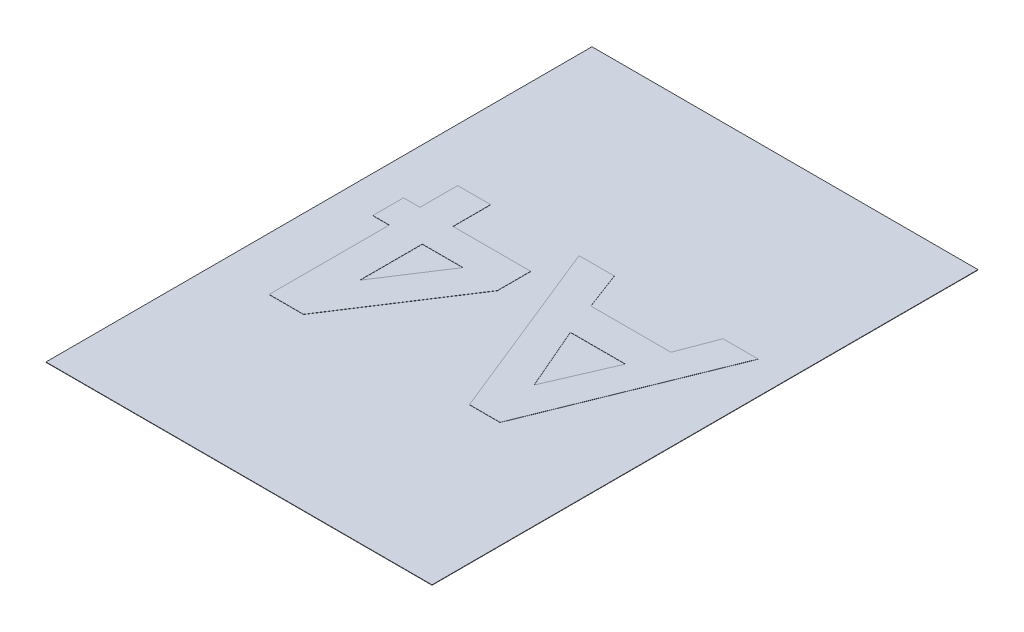
ISO-10303-21;
HEADER;
FILE_DESCRIPTION(('STEP AP214'),'2;1');
FILE_NAME('part.step','',(''),(''),'','','');
FILE_SCHEMA(('AUTOMOTIVE_DESIGN { 1 0 10303 214 1 1 1 1 }'));
ENDSEC;
DATA;
#1=APPLICATION_CONTEXT('core data for automotive mechanical design processes');
#2=APPLICATION_PROTOCOL_DEFINITION('international standard','automotive_design',2000,#1);
#3=PRODUCT_CONTEXT('',#1,'mechanical');
#4=PRODUCT('Part','Part','',(#3));
#5=PRODUCT_RELATED_PRODUCT_CATEGORY('part','',(#4));
#6=PRODUCT_DEFINITION_FORMATION('','',#4);
#7=PRODUCT_DEFINITION_CONTEXT('part definition',#1,'design');
#8=PRODUCT_DEFINITION('design','',#6,#7);
#9=PRODUCT_DEFINITION_SHAPE('','',#8);
#10=(LENGTH_UNIT() NAMED_UNIT(*) SI_UNIT(.MILLI.,.METRE.));
#11=(NAMED_UNIT(*) PLANE_ANGLE_UNIT() SI_UNIT($,.RADIAN.));
#12=(NAMED_UNIT(*) SI_UNIT($,.STERADIAN.) SOLID_ANGLE_UNIT());
#13=UNCERTAINTY_MEASURE_WITH_UNIT(LENGTH_MEASURE(1.E-05),#10,'distance_accuracy_value','');
#14=(GEOMETRIC_REPRESENTATION_CONTEXT(3) GLOBAL_UNCERTAINTY_ASSIGNED_CONTEXT((#13)) GLOBAL_UNIT_ASSIGNED_CONTEXT((#10,
#11,#12)) REPRESENTATION_CONTEXT('',''));
#15=CARTESIAN_POINT('',(0.,0.,0.));
#16=DIRECTION('',(0.,0.,1.));
#17=DIRECTION('',(1.,0.,0.));
#18=AXIS2_PLACEMENT_3D('',#15,#16,#17);
#19=CARTESIAN_POINT('',(0.,0.2,-297.));
#20=DIRECTION('',(0.,-1.,0.));
#21=DIRECTION('',(0.,0.,-1.));
#22=AXIS2_PLACEMENT_3D('',#19,#20,#21);
#23=PLANE('',#22);
#24=DIRECTION('',(0.,0.,1.));
#25=VECTOR('',#24,1.);
#26=CARTESIAN_POINT('',(89.2336306263011,0.2,-174.45865151581));
#27=LINE('',#26,#25);
#28=CARTESIAN_POINT('',(89.2336306263011,0.2,-174.45865151581));
#29=VERTEX_POINT('',#28);
#30=CARTESIAN_POINT('',(89.2336306263011,0.2,-156.289581002989));
#31=VERTEX_POINT('',#30);
#32=EDGE_CURVE('E258',#29,#31,#27,.T.);
#33=ORIENTED_EDGE('',*,*,#32,.T.);
#34=DIRECTION('',(-0.545200849923092,0.,0.838305453425622));
#35=VECTOR('',#34,1.);
#36=CARTESIAN_POINT('',(89.2336306263011,0.2,-156.289581002989));
#37=LINE('',#36,#35);
#38=CARTESIAN_POINT('',(47.6871562673268,0.2,-92.4073694645276));
#39=VERTEX_POINT('',#38);
#40=EDGE_CURVE('E239',#31,#39,#37,.T.);
#41=ORIENTED_EDGE('',*,*,#40,.T.);
#42=DIRECTION('',(-1.,0.,0.));
#43=VECTOR('',#42,1.);
#44=CARTESIAN_POINT('',(47.6871562673268,0.2,-92.4073694645276));
#45=LINE('',#44,#43);
#46=CARTESIAN_POINT('',(28.9772203698909,0.2,-92.4073694645276));
#47=VERTEX_POINT('',#46);
#48=EDGE_CURVE('E291',#39,#47,#45,.T.);
#49=ORIENTED_EDGE('',*,*,#48,.T.);
#50=DIRECTION('',(0.,0.,-1.));
#51=VECTOR('',#50,1.);
#52=CARTESIAN_POINT('',(28.9772203698909,0.2,-92.4073694645276));
#53=LINE('',#52,#51);
#54=CARTESIAN_POINT('',(28.9772203698909,0.2,-157.791984849143));
#55=VERTEX_POINT('',#54);
#56=EDGE_CURVE('E46',#47,#55,#53,.T.);
#57=ORIENTED_EDGE('',*,*,#56,.T.);
#58=DIRECTION('',(-1.,0.,0.));
#59=VECTOR('',#58,1.);
#60=CARTESIAN_POINT('',(28.9772203698909,0.2,-157.791984849143));
#61=LINE('',#60,#59);
#62=CARTESIAN_POINT('',(20.0028613955319,0.2,-157.791984849143));
#63=VERTEX_POINT('',#62);
#64=EDGE_CURVE('E295',#55,#63,#61,.T.);
#65=ORIENTED_EDGE('',*,*,#64,.T.);
#66=DIRECTION('',(0.,0.,-1.));
#67=VECTOR('',#66,1.);
#68=CARTESIAN_POINT('',(20.0028613955319,0.2,-157.791984849143));
#69=LINE('',#68,#67);
#70=CARTESIAN_POINT('',(20.0028613955319,0.2,-174.45865151581));
#71=VERTEX_POINT('',#70);
#72=EDGE_CURVE('E298',#63,#71,#69,.T.);
#73=ORIENTED_EDGE('',*,*,#72,.T.);
#74=DIRECTION('',(1.,0.,0.));
#75=VECTOR('',#74,1.);
#76=CARTESIAN_POINT('',(20.0028613955319,0.2,-174.45865151581));
#77=LINE('',#76,#75);
#78=CARTESIAN_POINT('',(28.9772203698909,0.2,-174.45865151581));
#79=VERTEX_POINT('',#78);
#80=EDGE_CURVE('E301',#71,#79,#77,.T.);
#81=ORIENTED_EDGE('',*,*,#80,.T.);
#82=DIRECTION('',(0.,0.,-1.));
#83=VECTOR('',#82,1.);
#84=CARTESIAN_POINT('',(28.9772203698909,0.2,-174.45865151581));
#85=LINE('',#84,#83);
#86=CARTESIAN_POINT('',(28.9772203698909,0.2,-194.97147202863));
#87=VERTEX_POINT('',#86);
#88=EDGE_CURVE('E304',#79,#87,#85,.T.);
#89=ORIENTED_EDGE('',*,*,#88,.T.);
#90=DIRECTION('',(1.,0.,0.));
#91=VECTOR('',#90,1.);
#92=CARTESIAN_POINT('',(28.9772203698909,0.2,-194.97147202863));
#93=LINE('',#92,#91);
#94=CARTESIAN_POINT('',(46.9259383186088,0.2,-194.97147202863));
#95=VERTEX_POINT('',#94);
#96=EDGE_CURVE('E307',#87,#95,#93,.T.);
#97=ORIENTED_EDGE('',*,*,#96,.T.);
#98=DIRECTION('',(0.,0.,1.));
#99=VECTOR('',#98,1.);
#100=CARTESIAN_POINT('',(46.9259383186088,0.2,-194.97147202863));
#101=LINE('',#100,#99);
#102=CARTESIAN_POINT('',(46.9259383186088,0.2,-174.45865151581));
#103=VERTEX_POINT('',#102);
#104=EDGE_CURVE('E310',#95,#103,#101,.T.);
#105=ORIENTED_EDGE('',*,*,#104,.T.);
#106=DIRECTION('',(1.,0.,0.));
#107=VECTOR('',#106,1.);
#108=CARTESIAN_POINT('',(46.9259383186088,0.2,-174.45865151581));
#109=LINE('',#108,#107);
#110=EDGE_CURVE('E313',#103,#29,#109,.T.);
#111=ORIENTED_EDGE('',*,*,#110,.T.);
#112=EDGE_LOOP('',(#33,#41,#49,#57,#65,#73,#81,#89,#97,#105,#111));
#113=FACE_BOUND('',#112,.T.);
#114=DIRECTION('',(0.,0.,1.));
#115=VECTOR('',#114,1.);
#116=CARTESIAN_POINT('',(0.,0.2,0.));
#117=LINE('',#116,#115);
#118=CARTESIAN_POINT('',(0.,0.2,-297.));
#119=VERTEX_POINT('',#118);
#120=CARTESIAN_POINT('',(0.,0.2,0.));
#121=VERTEX_POINT('',#120);
#122=EDGE_CURVE('E428',#119,#121,#117,.T.);
#123=ORIENTED_EDGE('',*,*,#122,.T.);
#124=DIRECTION('',(1.,0.,0.));
#125=VECTOR('',#124,1.);
#126=CARTESIAN_POINT('',(0.,0.2,0.));
#127=LINE('',#126,#125);
#128=CARTESIAN_POINT('',(210.,0.2,0.));
#129=VERTEX_POINT('',#128);
#130=EDGE_CURVE('E431',#121,#129,#127,.T.);
#131=ORIENTED_EDGE('',*,*,#130,.T.);
#132=DIRECTION('',(0.,0.,-1.));
#133=VECTOR('',#132,1.);
#134=CARTESIAN_POINT('',(210.,0.2,0.));
#135=LINE('',#134,#133);
#136=CARTESIAN_POINT('',(210.,0.2,-297.));
#137=VERTEX_POINT('',#136);
#138=EDGE_CURVE('E434',#129,#137,#135,.T.);
#139=ORIENTED_EDGE('',*,*,#138,.T.);
#140=DIRECTION('',(-1.,0.,0.));
#141=VECTOR('',#140,1.);
#142=CARTESIAN_POINT('',(0.,0.2,-297.));
#143=LINE('',#142,#141);
#144=EDGE_CURVE('E436',#137,#119,#143,.T.);
#145=ORIENTED_EDGE('',*,*,#144,.T.);
#146=EDGE_LOOP('',(#123,#131,#139,#145));
#147=FACE_BOUND('',#146,.T.);
#148=DIRECTION('',(1.,0.,0.));
#149=VECTOR('',#148,1.);
#150=CARTESIAN_POINT('',(173.288117805788,0.2,-194.97147202863));
#151=LINE('',#150,#149);
#152=CARTESIAN_POINT('',(173.288117805788,0.2,-194.97147202863));
#153=VERTEX_POINT('',#152);
#154=CARTESIAN_POINT('',(192.438758831429,0.2,-194.97147202863));
#155=VERTEX_POINT('',#154);
#156=EDGE_CURVE('E367',#153,#155,#151,.T.);
#157=ORIENTED_EDGE('',*,*,#156,.T.);
#158=DIRECTION('',(-0.374622732778073,0.,0.927177333677808));
#159=VECTOR('',#158,1.);
#160=CARTESIAN_POINT('',(192.438758831429,0.2,-194.97147202863));
#161=LINE('',#160,#159);
#162=CARTESIAN_POINT('',(152.034111395532,0.2,-94.9714720286302));
#163=VERTEX_POINT('',#162);
#164=EDGE_CURVE('E362',#155,#163,#161,.T.);
#165=ORIENTED_EDGE('',*,*,#164,.T.);
#166=DIRECTION('',(-1.,0.,0.));
#167=VECTOR('',#166,1.);
#168=CARTESIAN_POINT('',(152.034111395532,0.2,-94.9714720286302));
#169=LINE('',#168,#167);
#170=CARTESIAN_POINT('',(135.387476780147,0.2,-94.9714720286302));
#171=VERTEX_POINT('',#170);
#172=EDGE_CURVE('E391',#163,#171,#169,.T.);
#173=ORIENTED_EDGE('',*,*,#172,.T.);
#174=DIRECTION('',(-0.374463049601283,0.,-0.92724183710794));
#175=VECTOR('',#174,1.);
#176=CARTESIAN_POINT('',(135.387476780147,0.2,-94.9714720286302));
#177=LINE('',#176,#175);
#178=CARTESIAN_POINT('',(95.0028613955319,0.2,-194.97147202863));
#179=VERTEX_POINT('',#178);
#180=EDGE_CURVE('E394',#171,#179,#177,.T.);
#181=ORIENTED_EDGE('',*,*,#180,.T.);
#182=DIRECTION('',(1.,0.,0.));
#183=VECTOR('',#182,1.);
#184=CARTESIAN_POINT('',(95.0028613955319,0.2,-194.97147202863));
#185=LINE('',#184,#183);
#186=CARTESIAN_POINT('',(114.173534472455,0.2,-194.97147202863));
#187=VERTEX_POINT('',#186);
#188=EDGE_CURVE('E397',#179,#187,#185,.T.);
#189=ORIENTED_EDGE('',*,*,#188,.T.);
#190=DIRECTION('',(0.354323863096984,0.,0.935122772709568));
#191=VECTOR('',#190,1.);
#192=CARTESIAN_POINT('',(114.173534472455,0.2,-194.97147202863));
#193=LINE('',#192,#191);
#194=CARTESIAN_POINT('',(121.945970369891,0.2,-174.45865151581));
#195=VERTEX_POINT('',#194);
#196=EDGE_CURVE('E400',#187,#195,#193,.T.);
#197=ORIENTED_EDGE('',*,*,#196,.T.);
#198=DIRECTION('',(1.,0.,0.));
#199=VECTOR('',#198,1.);
#200=CARTESIAN_POINT('',(121.945970369891,0.2,-174.45865151581));
#201=LINE('',#200,#199);
#202=CARTESIAN_POINT('',(165.515681908352,0.2,-174.45865151581));
#203=VERTEX_POINT('',#202);
#204=EDGE_CURVE('E403',#195,#203,#201,.T.);
#205=ORIENTED_EDGE('',*,*,#204,.T.);
#206=DIRECTION('',(0.354323863096984,0.,-0.935122772709568));
#207=VECTOR('',#206,1.);
#208=CARTESIAN_POINT('',(165.515681908352,0.2,-174.45865151581));
#209=LINE('',#208,#207);
#210=EDGE_CURVE('E406',#203,#153,#209,.T.);
#211=ORIENTED_EDGE('',*,*,#210,.T.);
#212=EDGE_LOOP('',(#157,#165,#173,#181,#189,#197,#205,#211));
#213=FACE_BOUND('',#212,.T.);
#214=ADVANCED_FACE('F31',(#113,#147,#213),#23,.F.);
#215=CARTESIAN_POINT('',(0.,0.2,0.));
#216=DIRECTION('',(1.,0.,0.));
#217=DIRECTION('',(0.,0.,-1.));
#218=AXIS2_PLACEMENT_3D('',#215,#216,#217);
#219=PLANE('',#218);
#220=DIRECTION('',(0.,0.,1.));
#221=VECTOR('',#220,1.);
#222=CARTESIAN_POINT('',(0.,0.,0.));
#223=LINE('',#222,#221);
#224=CARTESIAN_POINT('',(0.,0.,-297.));
#225=VERTEX_POINT('',#224);
#226=CARTESIAN_POINT('',(0.,0.,0.));
#227=VERTEX_POINT('',#226);
#228=EDGE_CURVE('E413',#225,#227,#223,.T.);
#229=ORIENTED_EDGE('',*,*,#228,.T.);
#230=DIRECTION('',(0.,-1.,0.));
#231=VECTOR('',#230,1.);
#232=CARTESIAN_POINT('',(0.,0.2,0.));
#233=LINE('',#232,#231);
#234=EDGE_CURVE('E11',#121,#227,#233,.T.);
#235=ORIENTED_EDGE('',*,*,#234,.F.);
#236=ORIENTED_EDGE('',*,*,#122,.F.);
#237=DIRECTION('',(0.,-1.,0.));
#238=VECTOR('',#237,1.);
#239=CARTESIAN_POINT('',(0.,0.2,-297.));
#240=LINE('',#239,#238);
#241=EDGE_CURVE('E438',#119,#225,#240,.T.);
#242=ORIENTED_EDGE('',*,*,#241,.T.);
#243=EDGE_LOOP('',(#229,#235,#236,#242));
#244=FACE_BOUND('',#243,.T.);
#245=ADVANCED_FACE('F33',(#244),#219,.F.);
#246=CARTESIAN_POINT('',(0.,0.2,0.));
#247=DIRECTION('',(0.,0.,-1.));
#248=DIRECTION('',(-1.,0.,0.));
#249=AXIS2_PLACEMENT_3D('',#246,#247,#248);
#250=PLANE('',#249);
#251=DIRECTION('',(1.,0.,0.));
#252=VECTOR('',#251,1.);
#253=CARTESIAN_POINT('',(0.,0.,0.));
#254=LINE('',#253,#252);
#255=CARTESIAN_POINT('',(210.,0.,0.));
#256=VERTEX_POINT('',#255);
#257=EDGE_CURVE('E441',#227,#256,#254,.T.);
#258=ORIENTED_EDGE('',*,*,#257,.T.);
#259=DIRECTION('',(0.,-1.,0.));
#260=VECTOR('',#259,1.);
#261=CARTESIAN_POINT('',(210.,0.2,0.));
#262=LINE('',#261,#260);
#263=EDGE_CURVE('E39',#129,#256,#262,.T.);
#264=ORIENTED_EDGE('',*,*,#263,.F.);
#265=ORIENTED_EDGE('',*,*,#130,.F.);
#266=ORIENTED_EDGE('',*,*,#234,.T.);
#267=EDGE_LOOP('',(#258,#264,#265,#266));
#268=FACE_BOUND('',#267,.T.);
#269=ADVANCED_FACE('F471',(#268),#250,.F.);
#270=CARTESIAN_POINT('',(210.,0.2,0.));
#271=DIRECTION('',(-1.,0.,0.));
#272=DIRECTION('',(0.,0.,1.));
#273=AXIS2_PLACEMENT_3D('',#270,#271,#272);
#274=PLANE('',#273);
#275=DIRECTION('',(0.,0.,-1.));
#276=VECTOR('',#275,1.);
#277=CARTESIAN_POINT('',(210.,0.,0.));
#278=LINE('',#277,#276);
#279=CARTESIAN_POINT('',(210.,0.,-297.));
#280=VERTEX_POINT('',#279);
#281=EDGE_CURVE('E443',#256,#280,#278,.T.);
#282=ORIENTED_EDGE('',*,*,#281,.T.);
#283=DIRECTION('',(0.,-1.,0.));
#284=VECTOR('',#283,1.);
#285=CARTESIAN_POINT('',(210.,0.2,-297.));
#286=LINE('',#285,#284);
#287=EDGE_CURVE('E448',#137,#280,#286,.T.);
#288=ORIENTED_EDGE('',*,*,#287,.F.);
#289=ORIENTED_EDGE('',*,*,#138,.F.);
#290=ORIENTED_EDGE('',*,*,#263,.T.);
#291=EDGE_LOOP('',(#282,#288,#289,#290));
#292=FACE_BOUND('',#291,.T.);
#293=ADVANCED_FACE('F455',(#292),#274,.F.);
#294=CARTESIAN_POINT('',(0.,0.2,-297.));
#295=DIRECTION('',(0.,0.,1.));
#296=DIRECTION('',(1.,0.,0.));
#297=AXIS2_PLACEMENT_3D('',#294,#295,#296);
#298=PLANE('',#297);
#299=DIRECTION('',(-1.,0.,0.));
#300=VECTOR('',#299,1.);
#301=CARTESIAN_POINT('',(0.,0.,-297.));
#302=LINE('',#301,#300);
#303=EDGE_CURVE('E432',#280,#225,#302,.T.);
#304=ORIENTED_EDGE('',*,*,#303,.T.);
#305=ORIENTED_EDGE('',*,*,#241,.F.);
#306=ORIENTED_EDGE('',*,*,#144,.F.);
#307=ORIENTED_EDGE('',*,*,#287,.T.);
#308=EDGE_LOOP('',(#304,#305,#306,#307));
#309=FACE_BOUND('',#308,.T.);
#310=ADVANCED_FACE('F464',(#309),#298,.F.);
#311=CARTESIAN_POINT('',(0.,0.,-297.));
#312=DIRECTION('',(0.,-1.,0.));
#313=DIRECTION('',(0.,0.,-1.));
#314=AXIS2_PLACEMENT_3D('',#311,#312,#313);
#315=PLANE('',#314);
#316=ORIENTED_EDGE('',*,*,#228,.F.);
#317=ORIENTED_EDGE('',*,*,#303,.F.);
#318=ORIENTED_EDGE('',*,*,#281,.F.);
#319=ORIENTED_EDGE('',*,*,#257,.F.);
#320=EDGE_LOOP('',(#316,#317,#318,#319));
#321=FACE_BOUND('',#320,.T.);
#322=ADVANCED_FACE('F461',(#321),#315,.T.);
#323=CARTESIAN_POINT('',(152.034111395532,0.3,-94.9714720286302));
#324=DIRECTION('',(0.,-1.,0.));
#325=DIRECTION('',(0.,0.,-1.));
#326=AXIS2_PLACEMENT_3D('',#323,#324,#325);
#327=PLANE('',#326);
#328=DIRECTION('',(-0.374622732778073,0.,0.927177333677808));
#329=VECTOR('',#328,1.);
#330=CARTESIAN_POINT('',(192.438758831429,0.3,-194.97147202863));
#331=LINE('',#330,#329);
#332=CARTESIAN_POINT('',(192.438758831429,0.3,-194.97147202863));
#333=VERTEX_POINT('',#332);
#334=CARTESIAN_POINT('',(152.034111395532,0.3,-94.9714720286302));
#335=VERTEX_POINT('',#334);
#336=EDGE_CURVE('E363',#333,#335,#331,.T.);
#337=ORIENTED_EDGE('',*,*,#336,.F.);
#338=DIRECTION('',(1.,0.,0.));
#339=VECTOR('',#338,1.);
#340=CARTESIAN_POINT('',(173.288117805788,0.3,-194.97147202863));
#341=LINE('',#340,#339);
#342=CARTESIAN_POINT('',(173.288117805788,0.3,-194.97147202863));
#343=VERTEX_POINT('',#342);
#344=EDGE_CURVE('E385',#343,#333,#341,.T.);
#345=ORIENTED_EDGE('',*,*,#344,.F.);
#346=DIRECTION('',(0.354323863096984,0.,-0.935122772709568));
#347=VECTOR('',#346,1.);
#348=CARTESIAN_POINT('',(165.515681908352,0.3,-174.45865151581));
#349=LINE('',#348,#347);
#350=CARTESIAN_POINT('',(165.515681908352,0.3,-174.45865151581));
#351=VERTEX_POINT('',#350);
#352=EDGE_CURVE('E382',#351,#343,#349,.T.);
#353=ORIENTED_EDGE('',*,*,#352,.F.);
#354=DIRECTION('',(1.,0.,0.));
#355=VECTOR('',#354,1.);
#356=CARTESIAN_POINT('',(121.945970369891,0.3,-174.45865151581));
#357=LINE('',#356,#355);
#358=CARTESIAN_POINT('',(121.945970369891,0.3,-174.45865151581));
#359=VERTEX_POINT('',#358);
#360=EDGE_CURVE('E379',#359,#351,#357,.T.);
#361=ORIENTED_EDGE('',*,*,#360,.F.);
#362=DIRECTION('',(0.354323863096984,0.,0.935122772709568));
#363=VECTOR('',#362,1.);
#364=CARTESIAN_POINT('',(114.173534472455,0.3,-194.97147202863));
#365=LINE('',#364,#363);
#366=CARTESIAN_POINT('',(114.173534472455,0.3,-194.97147202863));
#367=VERTEX_POINT('',#366);
#368=EDGE_CURVE('E376',#367,#359,#365,.T.);
#369=ORIENTED_EDGE('',*,*,#368,.F.);
#370=DIRECTION('',(1.,0.,0.));
#371=VECTOR('',#370,1.);
#372=CARTESIAN_POINT('',(95.0028613955319,0.3,-194.97147202863));
#373=LINE('',#372,#371);
#374=CARTESIAN_POINT('',(95.0028613955319,0.3,-194.97147202863));
#375=VERTEX_POINT('',#374);
#376=EDGE_CURVE('E373',#375,#367,#373,.T.);
#377=ORIENTED_EDGE('',*,*,#376,.F.);
#378=DIRECTION('',(-0.374463049601283,0.,-0.92724183710794));
#379=VECTOR('',#378,1.);
#380=CARTESIAN_POINT('',(135.387476780147,0.3,-94.9714720286302));
#381=LINE('',#380,#379);
#382=CARTESIAN_POINT('',(135.387476780147,0.3,-94.9714720286302));
#383=VERTEX_POINT('',#382);
#384=EDGE_CURVE('E370',#383,#375,#381,.T.);
#385=ORIENTED_EDGE('',*,*,#384,.F.);
#386=DIRECTION('',(-1.,0.,0.));
#387=VECTOR('',#386,1.);
#388=CARTESIAN_POINT('',(152.034111395532,0.3,-94.9714720286302));
#389=LINE('',#388,#387);
#390=EDGE_CURVE('E366',#335,#383,#389,.T.);
#391=ORIENTED_EDGE('',*,*,#390,.F.);
#392=EDGE_LOOP('',(#337,#345,#353,#361,#369,#377,#385,#391));
#393=FACE_BOUND('',#392,.T.);
#394=DIRECTION('',(0.396283785267297,0.,0.91812807469014));
#395=VECTOR('',#394,1.);
#396=CARTESIAN_POINT('',(128.736835754506,0.3,-156.509933567092));
#397=LINE('',#396,#395);
#398=CARTESIAN_POINT('',(128.736835754506,0.3,-156.509933567092));
#399=VERTEX_POINT('',#398);
#400=CARTESIAN_POINT('',(143.720810113481,0.3,-121.794388695297));
#401=VERTEX_POINT('',#400);
#402=EDGE_CURVE('E340',#399,#401,#397,.T.);
#403=ORIENTED_EDGE('',*,*,#402,.F.);
#404=DIRECTION('',(-1.,0.,0.));
#405=VECTOR('',#404,1.);
#406=CARTESIAN_POINT('',(158.704784472455,0.3,-156.509933567092));
#407=LINE('',#406,#405);
#408=CARTESIAN_POINT('',(158.704784472455,0.3,-156.509933567092));
#409=VERTEX_POINT('',#408);
#410=EDGE_CURVE('E346',#409,#399,#407,.T.);
#411=ORIENTED_EDGE('',*,*,#410,.F.);
#412=DIRECTION('',(0.396283785267297,0.,-0.91812807469014));
#413=VECTOR('',#412,1.);
#414=CARTESIAN_POINT('',(143.720810113481,0.3,-121.794388695297));
#415=LINE('',#414,#413);
#416=EDGE_CURVE('E342',#401,#409,#415,.T.);
#417=ORIENTED_EDGE('',*,*,#416,.F.);
#418=EDGE_LOOP('',(#403,#411,#417));
#419=FACE_BOUND('',#418,.T.);
#420=ADVANCED_FACE('F514',(#393,#419),#327,.F.);
#421=CARTESIAN_POINT('',(192.438758831429,0.3,-194.97147202863));
#422=DIRECTION('',(0.927177333677808,0.,0.374622732778073));
#423=DIRECTION('',(0.374622732778073,0.,-0.927177333677808));
#424=AXIS2_PLACEMENT_3D('',#421,#422,#423);
#425=PLANE('',#424);
#426=ORIENTED_EDGE('',*,*,#164,.F.);
#427=DIRECTION('',(0.,-1.,0.));
#428=VECTOR('',#427,1.);
#429=CARTESIAN_POINT('',(192.438758831429,0.3,-194.97147202863));
#430=LINE('',#429,#428);
#431=EDGE_CURVE('E411',#333,#155,#430,.T.);
#432=ORIENTED_EDGE('',*,*,#431,.F.);
#433=ORIENTED_EDGE('',*,*,#336,.T.);
#434=DIRECTION('',(0.,-1.,0.));
#435=VECTOR('',#434,1.);
#436=CARTESIAN_POINT('',(152.034111395532,0.3,-94.9714720286302));
#437=LINE('',#436,#435);
#438=EDGE_CURVE('E388',#335,#163,#437,.T.);
#439=ORIENTED_EDGE('',*,*,#438,.T.);
#440=EDGE_LOOP('',(#426,#432,#433,#439));
#441=FACE_BOUND('',#440,.T.);
#442=ADVANCED_FACE('F516',(#441),#425,.T.);
#443=CARTESIAN_POINT('',(173.288117805788,0.3,-194.97147202863));
#444=DIRECTION('',(0.,0.,-1.));
#445=DIRECTION('',(-1.,0.,0.));
#446=AXIS2_PLACEMENT_3D('',#443,#444,#445);
#447=PLANE('',#446);
#448=ORIENTED_EDGE('',*,*,#156,.F.);
#449=DIRECTION('',(0.,-1.,0.));
#450=VECTOR('',#449,1.);
#451=CARTESIAN_POINT('',(173.288117805788,0.3,-194.97147202863));
#452=LINE('',#451,#450);
#453=EDGE_CURVE('E414',#343,#153,#452,.T.);
#454=ORIENTED_EDGE('',*,*,#453,.F.);
#455=ORIENTED_EDGE('',*,*,#344,.T.);
#456=ORIENTED_EDGE('',*,*,#431,.T.);
#457=EDGE_LOOP('',(#448,#454,#455,#456));
#458=FACE_BOUND('',#457,.T.);
#459=ADVANCED_FACE('F523',(#458),#447,.T.);
#460=CARTESIAN_POINT('',(165.515681908352,0.3,-174.45865151581));
#461=DIRECTION('',(-0.935122772709568,0.,-0.354323863096984));
#462=DIRECTION('',(-0.354323863096984,0.,0.935122772709568));
#463=AXIS2_PLACEMENT_3D('',#460,#461,#462);
#464=PLANE('',#463);
#465=ORIENTED_EDGE('',*,*,#210,.F.);
#466=DIRECTION('',(0.,-1.,0.));
#467=VECTOR('',#466,1.);
#468=CARTESIAN_POINT('',(165.515681908352,0.3,-174.45865151581));
#469=LINE('',#468,#467);
#470=EDGE_CURVE('E416',#351,#203,#469,.T.);
#471=ORIENTED_EDGE('',*,*,#470,.F.);
#472=ORIENTED_EDGE('',*,*,#352,.T.);
#473=ORIENTED_EDGE('',*,*,#453,.T.);
#474=EDGE_LOOP('',(#465,#471,#472,#473));
#475=FACE_BOUND('',#474,.T.);
#476=ADVANCED_FACE('F531',(#475),#464,.T.);
#477=CARTESIAN_POINT('',(121.945970369891,0.3,-174.45865151581));
#478=DIRECTION('',(0.,0.,-1.));
#479=DIRECTION('',(-1.,0.,0.));
#480=AXIS2_PLACEMENT_3D('',#477,#478,#479);
#481=PLANE('',#480);
#482=ORIENTED_EDGE('',*,*,#204,.F.);
#483=DIRECTION('',(0.,-1.,0.));
#484=VECTOR('',#483,1.);
#485=CARTESIAN_POINT('',(121.945970369891,0.3,-174.45865151581));
#486=LINE('',#485,#484);
#487=EDGE_CURVE('E418',#359,#195,#486,.T.);
#488=ORIENTED_EDGE('',*,*,#487,.F.);
#489=ORIENTED_EDGE('',*,*,#360,.T.);
#490=ORIENTED_EDGE('',*,*,#470,.T.);
#491=EDGE_LOOP('',(#482,#488,#489,#490));
#492=FACE_BOUND('',#491,.T.);
#493=ADVANCED_FACE('F535',(#492),#481,.T.);
#494=CARTESIAN_POINT('',(114.173534472455,0.3,-194.97147202863));
#495=DIRECTION('',(0.935122772709568,0.,-0.354323863096984));
#496=DIRECTION('',(-0.354323863096984,0.,-0.935122772709568));
#497=AXIS2_PLACEMENT_3D('',#494,#495,#496);
#498=PLANE('',#497);
#499=ORIENTED_EDGE('',*,*,#196,.F.);
#500=DIRECTION('',(0.,-1.,0.));
#501=VECTOR('',#500,1.);
#502=CARTESIAN_POINT('',(114.173534472455,0.3,-194.97147202863));
#503=LINE('',#502,#501);
#504=EDGE_CURVE('E420',#367,#187,#503,.T.);
#505=ORIENTED_EDGE('',*,*,#504,.F.);
#506=ORIENTED_EDGE('',*,*,#368,.T.);
#507=ORIENTED_EDGE('',*,*,#487,.T.);
#508=EDGE_LOOP('',(#499,#505,#506,#507));
#509=FACE_BOUND('',#508,.T.);
#510=ADVANCED_FACE('F539',(#509),#498,.T.);
#511=CARTESIAN_POINT('',(95.0028613955319,0.3,-194.97147202863));
#512=DIRECTION('',(0.,0.,-1.));
#513=DIRECTION('',(-1.,0.,0.));
#514=AXIS2_PLACEMENT_3D('',#511,#512,#513);
#515=PLANE('',#514);
#516=ORIENTED_EDGE('',*,*,#188,.F.);
#517=DIRECTION('',(0.,-1.,0.));
#518=VECTOR('',#517,1.);
#519=CARTESIAN_POINT('',(95.0028613955319,0.3,-194.97147202863));
#520=LINE('',#519,#518);
#521=EDGE_CURVE('E422',#375,#179,#520,.T.);
#522=ORIENTED_EDGE('',*,*,#521,.F.);
#523=ORIENTED_EDGE('',*,*,#376,.T.);
#524=ORIENTED_EDGE('',*,*,#504,.T.);
#525=EDGE_LOOP('',(#516,#522,#523,#524));
#526=FACE_BOUND('',#525,.T.);
#527=ADVANCED_FACE('F543',(#526),#515,.T.);
#528=CARTESIAN_POINT('',(135.387476780147,0.3,-94.9714720286302));
#529=DIRECTION('',(-0.92724183710794,0.,0.374463049601283));
#530=DIRECTION('',(0.374463049601283,0.,0.92724183710794));
#531=AXIS2_PLACEMENT_3D('',#528,#529,#530);
#532=PLANE('',#531);
#533=ORIENTED_EDGE('',*,*,#180,.F.);
#534=DIRECTION('',(0.,-1.,0.));
#535=VECTOR('',#534,1.);
#536=CARTESIAN_POINT('',(135.387476780147,0.3,-94.9714720286302));
#537=LINE('',#536,#535);
#538=EDGE_CURVE('E424',#383,#171,#537,.T.);
#539=ORIENTED_EDGE('',*,*,#538,.F.);
#540=ORIENTED_EDGE('',*,*,#384,.T.);
#541=ORIENTED_EDGE('',*,*,#521,.T.);
#542=EDGE_LOOP('',(#533,#539,#540,#541));
#543=FACE_BOUND('',#542,.T.);
#544=ADVANCED_FACE('F547',(#543),#532,.T.);
#545=CARTESIAN_POINT('',(152.034111395532,0.3,-94.9714720286302));
#546=DIRECTION('',(0.,0.,1.));
#547=DIRECTION('',(1.,0.,0.));
#548=AXIS2_PLACEMENT_3D('',#545,#546,#547);
#549=PLANE('',#548);
#550=ORIENTED_EDGE('',*,*,#172,.F.);
#551=ORIENTED_EDGE('',*,*,#438,.F.);
#552=ORIENTED_EDGE('',*,*,#390,.T.);
#553=ORIENTED_EDGE('',*,*,#538,.T.);
#554=EDGE_LOOP('',(#550,#551,#552,#553));
#555=FACE_BOUND('',#554,.T.);
#556=ADVANCED_FACE('F551',(#555),#549,.T.);
#557=CARTESIAN_POINT('',(128.736835754506,0.3,-156.509933567092));
#558=DIRECTION('',(0.91812807469014,0.,-0.396283785267296));
#559=DIRECTION('',(-0.396283785267297,0.,-0.91812807469014));
#560=AXIS2_PLACEMENT_3D('',#557,#558,#559);
#561=PLANE('',#560);
#562=DIRECTION('',(0.396283785267297,0.,0.91812807469014));
#563=VECTOR('',#562,1.);
#564=CARTESIAN_POINT('',(128.736835754506,0.2,-156.509933567092));
#565=LINE('',#564,#563);
#566=CARTESIAN_POINT('',(128.736835754506,0.2,-156.509933567092));
#567=VERTEX_POINT('',#566);
#568=CARTESIAN_POINT('',(143.720810113481,0.2,-121.794388695297));
#569=VERTEX_POINT('',#568);
#570=EDGE_CURVE('E320',#567,#569,#565,.T.);
#571=ORIENTED_EDGE('',*,*,#570,.F.);
#572=DIRECTION('',(0.,-1.,0.));
#573=VECTOR('',#572,1.);
#574=CARTESIAN_POINT('',(128.736835754506,0.3,-156.509933567092));
#575=LINE('',#574,#573);
#576=EDGE_CURVE('E348',#399,#567,#575,.T.);
#577=ORIENTED_EDGE('',*,*,#576,.F.);
#578=ORIENTED_EDGE('',*,*,#402,.T.);
#579=DIRECTION('',(0.,-1.,0.));
#580=VECTOR('',#579,1.);
#581=CARTESIAN_POINT('',(143.720810113481,0.3,-121.794388695297));
#582=LINE('',#581,#580);
#583=EDGE_CURVE('E359',#401,#569,#582,.T.);
#584=ORIENTED_EDGE('',*,*,#583,.T.);
#585=EDGE_LOOP('',(#571,#577,#578,#584));
#586=FACE_BOUND('',#585,.T.);
#587=ADVANCED_FACE('F509',(#586),#561,.T.);
#588=CARTESIAN_POINT('',(143.720810113481,0.3,-121.794388695297));
#589=DIRECTION('',(-0.91812807469014,0.,-0.396283785267296));
#590=DIRECTION('',(-0.396283785267297,0.,0.91812807469014));
#591=AXIS2_PLACEMENT_3D('',#588,#589,#590);
#592=PLANE('',#591);
#593=DIRECTION('',(0.396283785267297,0.,-0.91812807469014));
#594=VECTOR('',#593,1.);
#595=CARTESIAN_POINT('',(143.720810113481,0.2,-121.794388695297));
#596=LINE('',#595,#594);
#597=CARTESIAN_POINT('',(158.704784472455,0.2,-156.509933567092));
#598=VERTEX_POINT('',#597);
#599=EDGE_CURVE('E351',#569,#598,#596,.T.);
#600=ORIENTED_EDGE('',*,*,#599,.F.);
#601=ORIENTED_EDGE('',*,*,#583,.F.);
#602=ORIENTED_EDGE('',*,*,#416,.T.);
#603=DIRECTION('',(0.,-1.,0.));
#604=VECTOR('',#603,1.);
#605=CARTESIAN_POINT('',(158.704784472455,0.3,-156.509933567092));
#606=LINE('',#605,#604);
#607=EDGE_CURVE('E357',#409,#598,#606,.T.);
#608=ORIENTED_EDGE('',*,*,#607,.T.);
#609=EDGE_LOOP('',(#600,#601,#602,#608));
#610=FACE_BOUND('',#609,.T.);
#611=ADVANCED_FACE('F500',(#610),#592,.T.);
#612=CARTESIAN_POINT('',(158.704784472455,0.3,-156.509933567092));
#613=DIRECTION('',(0.,0.,1.));
#614=DIRECTION('',(1.,0.,0.));
#615=AXIS2_PLACEMENT_3D('',#612,#613,#614);
#616=PLANE('',#615);
#617=DIRECTION('',(-1.,0.,0.));
#618=VECTOR('',#617,1.);
#619=CARTESIAN_POINT('',(158.704784472455,0.2,-156.509933567092));
#620=LINE('',#619,#618);
#621=EDGE_CURVE('E343',#598,#567,#620,.T.);
#622=ORIENTED_EDGE('',*,*,#621,.F.);
#623=ORIENTED_EDGE('',*,*,#607,.F.);
#624=ORIENTED_EDGE('',*,*,#410,.T.);
#625=ORIENTED_EDGE('',*,*,#576,.T.);
#626=EDGE_LOOP('',(#622,#623,#624,#625));
#627=FACE_BOUND('',#626,.T.);
#628=ADVANCED_FACE('F491',(#627),#616,.T.);
#629=ORIENTED_EDGE('',*,*,#621,.T.);
#630=ORIENTED_EDGE('',*,*,#570,.T.);
#631=ORIENTED_EDGE('',*,*,#599,.T.);
#632=EDGE_LOOP('',(#629,#630,#631));
#633=FACE_BOUND('',#632,.T.);
#634=ADVANCED_FACE('F482',(#633),#23,.F.);
#635=CARTESIAN_POINT('',(47.6871562673268,0.3,-92.4073694645276));
#636=DIRECTION('',(0.,-1.,0.));
#637=DIRECTION('',(0.,0.,-1.));
#638=AXIS2_PLACEMENT_3D('',#635,#636,#637);
#639=PLANE('',#638);
#640=DIRECTION('',(-0.545200849923092,0.,0.838305453425622));
#641=VECTOR('',#640,1.);
#642=CARTESIAN_POINT('',(89.2336306263011,0.3,-156.289581002989));
#643=LINE('',#642,#641);
#644=CARTESIAN_POINT('',(89.2336306263011,0.3,-156.289581002989));
#645=VERTEX_POINT('',#644);
#646=CARTESIAN_POINT('',(47.6871562673268,0.3,-92.4073694645276));
#647=VERTEX_POINT('',#646);
#648=EDGE_CURVE('E254',#645,#647,#643,.T.);
#649=ORIENTED_EDGE('',*,*,#648,.F.);
#650=DIRECTION('',(0.,0.,1.));
#651=VECTOR('',#650,1.);
#652=CARTESIAN_POINT('',(89.2336306263011,0.3,-174.45865151581));
#653=LINE('',#652,#651);
#654=CARTESIAN_POINT('',(89.2336306263011,0.3,-174.45865151581));
#655=VERTEX_POINT('',#654);
#656=EDGE_CURVE('E285',#655,#645,#653,.T.);
#657=ORIENTED_EDGE('',*,*,#656,.F.);
#658=DIRECTION('',(1.,0.,0.));
#659=VECTOR('',#658,1.);
#660=CARTESIAN_POINT('',(46.9259383186088,0.3,-174.45865151581));
#661=LINE('',#660,#659);
#662=CARTESIAN_POINT('',(46.9259383186088,0.3,-174.45865151581));
#663=VERTEX_POINT('',#662);
#664=EDGE_CURVE('E282',#663,#655,#661,.T.);
#665=ORIENTED_EDGE('',*,*,#664,.F.);
#666=DIRECTION('',(0.,0.,1.));
#667=VECTOR('',#666,1.);
#668=CARTESIAN_POINT('',(46.9259383186088,0.3,-194.97147202863));
#669=LINE('',#668,#667);
#670=CARTESIAN_POINT('',(46.9259383186088,0.3,-194.97147202863));
#671=VERTEX_POINT('',#670);
#672=EDGE_CURVE('E279',#671,#663,#669,.T.);
#673=ORIENTED_EDGE('',*,*,#672,.F.);
#674=DIRECTION('',(1.,0.,0.));
#675=VECTOR('',#674,1.);
#676=CARTESIAN_POINT('',(28.9772203698909,0.3,-194.97147202863));
#677=LINE('',#676,#675);
#678=CARTESIAN_POINT('',(28.9772203698909,0.3,-194.97147202863));
#679=VERTEX_POINT('',#678);
#680=EDGE_CURVE('E276',#679,#671,#677,.T.);
#681=ORIENTED_EDGE('',*,*,#680,.F.);
#682=DIRECTION('',(0.,0.,-1.));
#683=VECTOR('',#682,1.);
#684=CARTESIAN_POINT('',(28.9772203698909,0.3,-174.45865151581));
#685=LINE('',#684,#683);
#686=CARTESIAN_POINT('',(28.9772203698909,0.3,-174.45865151581));
#687=VERTEX_POINT('',#686);
#688=EDGE_CURVE('E273',#687,#679,#685,.T.);
#689=ORIENTED_EDGE('',*,*,#688,.F.);
#690=DIRECTION('',(1.,0.,0.));
#691=VECTOR('',#690,1.);
#692=CARTESIAN_POINT('',(20.0028613955319,0.3,-174.45865151581));
#693=LINE('',#692,#691);
#694=CARTESIAN_POINT('',(20.0028613955319,0.3,-174.45865151581));
#695=VERTEX_POINT('',#694);
#696=EDGE_CURVE('E270',#695,#687,#693,.T.);
#697=ORIENTED_EDGE('',*,*,#696,.F.);
#698=DIRECTION('',(0.,0.,-1.));
#699=VECTOR('',#698,1.);
#700=CARTESIAN_POINT('',(20.0028613955319,0.3,-157.791984849143));
#701=LINE('',#700,#699);
#702=CARTESIAN_POINT('',(20.0028613955319,0.3,-157.791984849143));
#703=VERTEX_POINT('',#702);
#704=EDGE_CURVE('E267',#703,#695,#701,.T.);
#705=ORIENTED_EDGE('',*,*,#704,.F.);
#706=DIRECTION('',(-1.,0.,0.));
#707=VECTOR('',#706,1.);
#708=CARTESIAN_POINT('',(28.9772203698909,0.3,-157.791984849143));
#709=LINE('',#708,#707);
#710=CARTESIAN_POINT('',(28.9772203698909,0.3,-157.791984849143));
#711=VERTEX_POINT('',#710);
#712=EDGE_CURVE('E264',#711,#703,#709,.T.);
#713=ORIENTED_EDGE('',*,*,#712,.F.);
#714=DIRECTION('',(0.,0.,-1.));
#715=VECTOR('',#714,1.);
#716=CARTESIAN_POINT('',(28.9772203698909,0.3,-92.4073694645276));
#717=LINE('',#716,#715);
#718=CARTESIAN_POINT('',(28.9772203698909,0.3,-92.4073694645276));
#719=VERTEX_POINT('',#718);
#720=EDGE_CURVE('E261',#719,#711,#717,.T.);
#721=ORIENTED_EDGE('',*,*,#720,.F.);
#722=DIRECTION('',(-1.,0.,0.));
#723=VECTOR('',#722,1.);
#724=CARTESIAN_POINT('',(47.6871562673268,0.3,-92.4073694645276));
#725=LINE('',#724,#723);
#726=EDGE_CURVE('E257',#647,#719,#725,.T.);
#727=ORIENTED_EDGE('',*,*,#726,.F.);
#728=EDGE_LOOP('',(#649,#657,#665,#673,#681,#689,#697,#705,#713,#721,#727));
#729=FACE_BOUND('',#728,.T.);
#730=DIRECTION('',(-1.,0.,0.));
#731=VECTOR('',#730,1.);
#732=CARTESIAN_POINT('',(69.0613549852755,0.3,-157.791984849143));
#733=LINE('',#732,#731);
#734=CARTESIAN_POINT('',(69.0613549852755,0.3,-157.791984849143));
#735=VERTEX_POINT('',#734);
#736=CARTESIAN_POINT('',(46.9259383186088,0.3,-157.791984849143));
#737=VERTEX_POINT('',#736);
#738=EDGE_CURVE('E223',#735,#737,#733,.T.);
#739=ORIENTED_EDGE('',*,*,#738,.F.);
#740=DIRECTION('',(0.545213788883921,0.,-0.838297038293015));
#741=VECTOR('',#740,1.);
#742=CARTESIAN_POINT('',(46.9259383186088,0.3,-123.757529720938));
#743=LINE('',#742,#741);
#744=CARTESIAN_POINT('',(46.9259383186088,0.3,-123.757529720938));
#745=VERTEX_POINT('',#744);
#746=EDGE_CURVE('E243',#745,#735,#743,.T.);
#747=ORIENTED_EDGE('',*,*,#746,.F.);
#748=DIRECTION('',(0.,0.,1.));
#749=VECTOR('',#748,1.);
#750=CARTESIAN_POINT('',(46.9259383186088,0.3,-157.791984849143));
#751=LINE('',#750,#749);
#752=EDGE_CURVE('E231',#737,#745,#751,.T.);
#753=ORIENTED_EDGE('',*,*,#752,.F.);
#754=EDGE_LOOP('',(#739,#747,#753));
#755=FACE_BOUND('',#754,.T.);
#756=ADVANCED_FACE('F242',(#729,#755),#639,.F.);
#757=CARTESIAN_POINT('',(89.2336306263011,0.3,-156.289581002989));
#758=DIRECTION('',(0.838305453425622,0.,0.545200849923092));
#759=DIRECTION('',(0.545200849923092,0.,-0.838305453425622));
#760=AXIS2_PLACEMENT_3D('',#757,#758,#759);
#761=PLANE('',#760);
#762=ORIENTED_EDGE('',*,*,#40,.F.);
#763=DIRECTION('',(0.,-1.,0.));
#764=VECTOR('',#763,1.);
#765=CARTESIAN_POINT('',(89.2336306263011,0.3,-156.289581002989));
#766=LINE('',#765,#764);
#767=EDGE_CURVE('E318',#645,#31,#766,.T.);
#768=ORIENTED_EDGE('',*,*,#767,.F.);
#769=ORIENTED_EDGE('',*,*,#648,.T.);
#770=DIRECTION('',(0.,-1.,0.));
#771=VECTOR('',#770,1.);
#772=CARTESIAN_POINT('',(47.6871562673268,0.3,-92.4073694645276));
#773=LINE('',#772,#771);
#774=EDGE_CURVE('E288',#647,#39,#773,.T.);
#775=ORIENTED_EDGE('',*,*,#774,.T.);
#776=EDGE_LOOP('',(#762,#768,#769,#775));
#777=FACE_BOUND('',#776,.T.);
#778=ADVANCED_FACE('F497',(#777),#761,.T.);
#779=CARTESIAN_POINT('',(89.2336306263011,0.3,-174.45865151581));
#780=DIRECTION('',(1.,0.,0.));
#781=DIRECTION('',(0.,0.,-1.));
#782=AXIS2_PLACEMENT_3D('',#779,#780,#781);
#783=PLANE('',#782);
#784=ORIENTED_EDGE('',*,*,#32,.F.);
#785=DIRECTION('',(0.,-1.,0.));
#786=VECTOR('',#785,1.);
#787=CARTESIAN_POINT('',(89.2336306263011,0.3,-174.45865151581));
#788=LINE('',#787,#786);
#789=EDGE_CURVE('E321',#655,#29,#788,.T.);
#790=ORIENTED_EDGE('',*,*,#789,.F.);
#791=ORIENTED_EDGE('',*,*,#656,.T.);
#792=ORIENTED_EDGE('',*,*,#767,.T.);
#793=EDGE_LOOP('',(#784,#790,#791,#792));
#794=FACE_BOUND('',#793,.T.);
#795=ADVANCED_FACE('F580',(#794),#783,.T.);
#796=CARTESIAN_POINT('',(46.9259383186088,0.3,-174.45865151581));
#797=DIRECTION('',(0.,0.,-1.));
#798=DIRECTION('',(-1.,0.,0.));
#799=AXIS2_PLACEMENT_3D('',#796,#797,#798);
#800=PLANE('',#799);
#801=ORIENTED_EDGE('',*,*,#110,.F.);
#802=DIRECTION('',(0.,-1.,0.));
#803=VECTOR('',#802,1.);
#804=CARTESIAN_POINT('',(46.9259383186088,0.3,-174.45865151581));
#805=LINE('',#804,#803);
#806=EDGE_CURVE('E323',#663,#103,#805,.T.);
#807=ORIENTED_EDGE('',*,*,#806,.F.);
#808=ORIENTED_EDGE('',*,*,#664,.T.);
#809=ORIENTED_EDGE('',*,*,#789,.T.);
#810=EDGE_LOOP('',(#801,#807,#808,#809));
#811=FACE_BOUND('',#810,.T.);
#812=ADVANCED_FACE('F612',(#811),#800,.T.);
#813=CARTESIAN_POINT('',(46.9259383186088,0.3,-194.97147202863));
#814=DIRECTION('',(1.,0.,0.));
#815=DIRECTION('',(0.,0.,-1.));
#816=AXIS2_PLACEMENT_3D('',#813,#814,#815);
#817=PLANE('',#816);
#818=ORIENTED_EDGE('',*,*,#104,.F.);
#819=DIRECTION('',(0.,-1.,0.));
#820=VECTOR('',#819,1.);
#821=CARTESIAN_POINT('',(46.9259383186088,0.3,-194.97147202863));
#822=LINE('',#821,#820);
#823=EDGE_CURVE('E325',#671,#95,#822,.T.);
#824=ORIENTED_EDGE('',*,*,#823,.F.);
#825=ORIENTED_EDGE('',*,*,#672,.T.);
#826=ORIENTED_EDGE('',*,*,#806,.T.);
#827=EDGE_LOOP('',(#818,#824,#825,#826));
#828=FACE_BOUND('',#827,.T.);
#829=ADVANCED_FACE('F608',(#828),#817,.T.);
#830=CARTESIAN_POINT('',(28.9772203698909,0.3,-194.97147202863));
#831=DIRECTION('',(0.,0.,-1.));
#832=DIRECTION('',(-1.,0.,0.));
#833=AXIS2_PLACEMENT_3D('',#830,#831,#832);
#834=PLANE('',#833);
#835=ORIENTED_EDGE('',*,*,#96,.F.);
#836=DIRECTION('',(0.,-1.,0.));
#837=VECTOR('',#836,1.);
#838=CARTESIAN_POINT('',(28.9772203698909,0.3,-194.97147202863));
#839=LINE('',#838,#837);
#840=EDGE_CURVE('E327',#679,#87,#839,.T.);
#841=ORIENTED_EDGE('',*,*,#840,.F.);
#842=ORIENTED_EDGE('',*,*,#680,.T.);
#843=ORIENTED_EDGE('',*,*,#823,.T.);
#844=EDGE_LOOP('',(#835,#841,#842,#843));
#845=FACE_BOUND('',#844,.T.);
#846=ADVANCED_FACE('F604',(#845),#834,.T.);
#847=CARTESIAN_POINT('',(28.9772203698909,0.3,-174.45865151581));
#848=DIRECTION('',(-1.,0.,0.));
#849=DIRECTION('',(0.,0.,1.));
#850=AXIS2_PLACEMENT_3D('',#847,#848,#849);
#851=PLANE('',#850);
#852=ORIENTED_EDGE('',*,*,#88,.F.);
#853=DIRECTION('',(0.,-1.,0.));
#854=VECTOR('',#853,1.);
#855=CARTESIAN_POINT('',(28.9772203698909,0.3,-174.45865151581));
#856=LINE('',#855,#854);
#857=EDGE_CURVE('E329',#687,#79,#856,.T.);
#858=ORIENTED_EDGE('',*,*,#857,.F.);
#859=ORIENTED_EDGE('',*,*,#688,.T.);
#860=ORIENTED_EDGE('',*,*,#840,.T.);
#861=EDGE_LOOP('',(#852,#858,#859,#860));
#862=FACE_BOUND('',#861,.T.);
#863=ADVANCED_FACE('F600',(#862),#851,.T.);
#864=CARTESIAN_POINT('',(20.0028613955319,0.3,-174.45865151581));
#865=DIRECTION('',(0.,0.,-1.));
#866=DIRECTION('',(-1.,0.,0.));
#867=AXIS2_PLACEMENT_3D('',#864,#865,#866);
#868=PLANE('',#867);
#869=ORIENTED_EDGE('',*,*,#80,.F.);
#870=DIRECTION('',(0.,-1.,0.));
#871=VECTOR('',#870,1.);
#872=CARTESIAN_POINT('',(20.0028613955319,0.3,-174.45865151581));
#873=LINE('',#872,#871);
#874=EDGE_CURVE('E331',#695,#71,#873,.T.);
#875=ORIENTED_EDGE('',*,*,#874,.F.);
#876=ORIENTED_EDGE('',*,*,#696,.T.);
#877=ORIENTED_EDGE('',*,*,#857,.T.);
#878=EDGE_LOOP('',(#869,#875,#876,#877));
#879=FACE_BOUND('',#878,.T.);
#880=ADVANCED_FACE('F596',(#879),#868,.T.);
#881=CARTESIAN_POINT('',(20.0028613955319,0.3,-157.791984849143));
#882=DIRECTION('',(-1.,0.,0.));
#883=DIRECTION('',(0.,0.,1.));
#884=AXIS2_PLACEMENT_3D('',#881,#882,#883);
#885=PLANE('',#884);
#886=ORIENTED_EDGE('',*,*,#72,.F.);
#887=DIRECTION('',(0.,-1.,0.));
#888=VECTOR('',#887,1.);
#889=CARTESIAN_POINT('',(20.0028613955319,0.3,-157.791984849143));
#890=LINE('',#889,#888);
#891=EDGE_CURVE('E333',#703,#63,#890,.T.);
#892=ORIENTED_EDGE('',*,*,#891,.F.);
#893=ORIENTED_EDGE('',*,*,#704,.T.);
#894=ORIENTED_EDGE('',*,*,#874,.T.);
#895=EDGE_LOOP('',(#886,#892,#893,#894));
#896=FACE_BOUND('',#895,.T.);
#897=ADVANCED_FACE('F592',(#896),#885,.T.);
#898=CARTESIAN_POINT('',(28.9772203698909,0.3,-157.791984849143));
#899=DIRECTION('',(0.,0.,1.));
#900=DIRECTION('',(1.,0.,0.));
#901=AXIS2_PLACEMENT_3D('',#898,#899,#900);
#902=PLANE('',#901);
#903=ORIENTED_EDGE('',*,*,#64,.F.);
#904=DIRECTION('',(0.,-1.,0.));
#905=VECTOR('',#904,1.);
#906=CARTESIAN_POINT('',(28.9772203698909,0.3,-157.791984849143));
#907=LINE('',#906,#905);
#908=EDGE_CURVE('E335',#711,#55,#907,.T.);
#909=ORIENTED_EDGE('',*,*,#908,.F.);
#910=ORIENTED_EDGE('',*,*,#712,.T.);
#911=ORIENTED_EDGE('',*,*,#891,.T.);
#912=EDGE_LOOP('',(#903,#909,#910,#911));
#913=FACE_BOUND('',#912,.T.);
#914=ADVANCED_FACE('F589',(#913),#902,.T.);
#915=CARTESIAN_POINT('',(28.9772203698909,0.3,-92.4073694645276));
#916=DIRECTION('',(-1.,0.,0.));
#917=DIRECTION('',(0.,0.,1.));
#918=AXIS2_PLACEMENT_3D('',#915,#916,#917);
#919=PLANE('',#918);
#920=ORIENTED_EDGE('',*,*,#56,.F.);
#921=DIRECTION('',(0.,-1.,0.));
#922=VECTOR('',#921,1.);
#923=CARTESIAN_POINT('',(28.9772203698909,0.3,-92.4073694645276));
#924=LINE('',#923,#922);
#925=EDGE_CURVE('E337',#719,#47,#924,.T.);
#926=ORIENTED_EDGE('',*,*,#925,.F.);
#927=ORIENTED_EDGE('',*,*,#720,.T.);
#928=ORIENTED_EDGE('',*,*,#908,.T.);
#929=EDGE_LOOP('',(#920,#926,#927,#928));
#930=FACE_BOUND('',#929,.T.);
#931=ADVANCED_FACE('F585',(#930),#919,.T.);
#932=CARTESIAN_POINT('',(47.6871562673268,0.3,-92.4073694645276));
#933=DIRECTION('',(0.,0.,1.));
#934=DIRECTION('',(1.,0.,0.));
#935=AXIS2_PLACEMENT_3D('',#932,#933,#934);
#936=PLANE('',#935);
#937=ORIENTED_EDGE('',*,*,#48,.F.);
#938=ORIENTED_EDGE('',*,*,#774,.F.);
#939=ORIENTED_EDGE('',*,*,#726,.T.);
#940=ORIENTED_EDGE('',*,*,#925,.T.);
#941=EDGE_LOOP('',(#937,#938,#939,#940));
#942=FACE_BOUND('',#941,.T.);
#943=ADVANCED_FACE('F582',(#942),#936,.T.);
#944=CARTESIAN_POINT('',(69.0613549852755,0.3,-157.791984849143));
#945=DIRECTION('',(0.,0.,1.));
#946=DIRECTION('',(1.,0.,0.));
#947=AXIS2_PLACEMENT_3D('',#944,#945,#946);
#948=PLANE('',#947);
#949=DIRECTION('',(-1.,0.,0.));
#950=VECTOR('',#949,1.);
#951=CARTESIAN_POINT('',(69.0613549852755,0.2,-157.791984849143));
#952=LINE('',#951,#950);
#953=CARTESIAN_POINT('',(69.0613549852755,0.2,-157.791984849143));
#954=VERTEX_POINT('',#953);
#955=CARTESIAN_POINT('',(46.9259383186088,0.2,-157.791984849143));
#956=VERTEX_POINT('',#955);
#957=EDGE_CURVE('E247',#954,#956,#952,.T.);
#958=ORIENTED_EDGE('',*,*,#957,.F.);
#959=DIRECTION('',(0.,-1.,0.));
#960=VECTOR('',#959,1.);
#961=CARTESIAN_POINT('',(69.0613549852755,0.3,-157.791984849143));
#962=LINE('',#961,#960);
#963=EDGE_CURVE('E54',#735,#954,#962,.T.);
#964=ORIENTED_EDGE('',*,*,#963,.F.);
#965=ORIENTED_EDGE('',*,*,#738,.T.);
#966=DIRECTION('',(0.,-1.,0.));
#967=VECTOR('',#966,1.);
#968=CARTESIAN_POINT('',(46.9259383186088,0.3,-157.791984849143));
#969=LINE('',#968,#967);
#970=EDGE_CURVE('E226',#737,#956,#969,.T.);
#971=ORIENTED_EDGE('',*,*,#970,.T.);
#972=EDGE_LOOP('',(#958,#964,#965,#971));
#973=FACE_BOUND('',#972,.T.);
#974=ADVANCED_FACE('F225',(#973),#948,.T.);
#975=CARTESIAN_POINT('',(46.9259383186088,0.3,-157.791984849143));
#976=DIRECTION('',(1.,0.,0.));
#977=DIRECTION('',(0.,0.,-1.));
#978=AXIS2_PLACEMENT_3D('',#975,#976,#977);
#979=PLANE('',#978);
#980=DIRECTION('',(0.,0.,1.));
#981=VECTOR('',#980,1.);
#982=CARTESIAN_POINT('',(46.9259383186088,0.2,-157.791984849143));
#983=LINE('',#982,#981);
#984=CARTESIAN_POINT('',(46.9259383186088,0.2,-123.757529720938));
#985=VERTEX_POINT('',#984);
#986=EDGE_CURVE('E238',#956,#985,#983,.T.);
#987=ORIENTED_EDGE('',*,*,#986,.F.);
#988=ORIENTED_EDGE('',*,*,#970,.F.);
#989=ORIENTED_EDGE('',*,*,#752,.T.);
#990=DIRECTION('',(0.,-1.,0.));
#991=VECTOR('',#990,1.);
#992=CARTESIAN_POINT('',(46.9259383186088,0.3,-123.757529720938));
#993=LINE('',#992,#991);
#994=EDGE_CURVE('E240',#745,#985,#993,.T.);
#995=ORIENTED_EDGE('',*,*,#994,.T.);
#996=EDGE_LOOP('',(#987,#988,#989,#995));
#997=FACE_BOUND('',#996,.T.);
#998=ADVANCED_FACE('F236',(#997),#979,.T.);
#999=CARTESIAN_POINT('',(46.9259383186088,0.3,-123.757529720938));
#1000=DIRECTION('',(-0.838297038293014,0.,-0.54521378888392));
#1001=DIRECTION('',(-0.54521378888392,0.,0.838297038293015));
#1002=AXIS2_PLACEMENT_3D('',#999,#1000,#1001);
#1003=PLANE('',#1002);
#1004=DIRECTION('',(0.545213788883921,0.,-0.838297038293015));
#1005=VECTOR('',#1004,1.);
#1006=CARTESIAN_POINT('',(46.9259383186088,0.2,-123.757529720938));
#1007=LINE('',#1006,#1005);
#1008=EDGE_CURVE('E232',#985,#954,#1007,.T.);
#1009=ORIENTED_EDGE('',*,*,#1008,.F.);
#1010=ORIENTED_EDGE('',*,*,#994,.F.);
#1011=ORIENTED_EDGE('',*,*,#746,.T.);
#1012=ORIENTED_EDGE('',*,*,#963,.T.);
#1013=EDGE_LOOP('',(#1009,#1010,#1011,#1012));
#1014=FACE_BOUND('',#1013,.T.);
#1015=ADVANCED_FACE('F488',(#1014),#1003,.T.);
#1016=ORIENTED_EDGE('',*,*,#1008,.T.);
#1017=ORIENTED_EDGE('',*,*,#957,.T.);
#1018=ORIENTED_EDGE('',*,*,#986,.T.);
#1019=EDGE_LOOP('',(#1016,#1017,#1018));
#1020=FACE_BOUND('',#1019,.T.);
#1021=ADVANCED_FACE('F481',(#1020),#23,.F.);
#1022=CLOSED_SHELL('',(#214,#245,#269,#293,#310,#322,#420,#442,#459,#476,#493,#510,#527,#544,
#556,#587,#611,#628,#634,#756,#778,#795,#812,#829,#846,#863,#880,#897,#914,#931,#943,#974,#998,
#1015,#1021));
#1023=MANIFOLD_SOLID_BREP('B2',#1022);
#1024=ADVANCED_BREP_SHAPE_REPRESENTATION('',(#18,#1023),#14);
#1025=SHAPE_DEFINITION_REPRESENTATION(#9,#1024);
ENDSEC;
END-ISO-10303-21;
